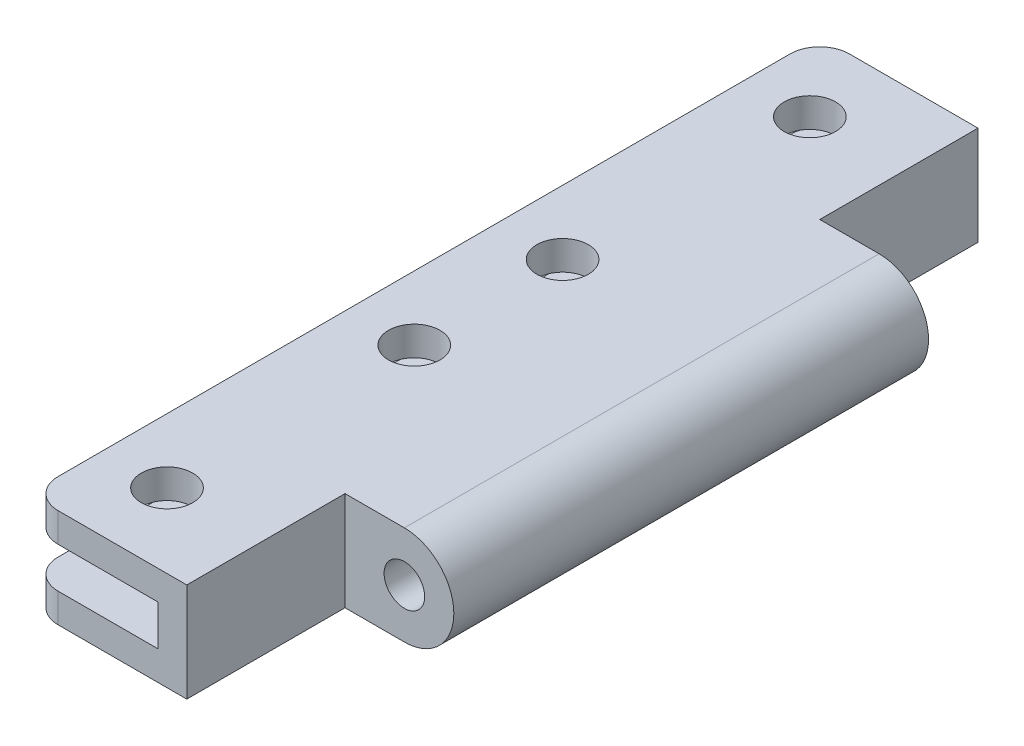
ISO-10303-21;
HEADER;
FILE_DESCRIPTION(('STEP AP214'),'2;1');
FILE_NAME('part.step','',(''),(''),'','','');
FILE_SCHEMA(('AUTOMOTIVE_DESIGN { 1 0 10303 214 1 1 1 1 }'));
ENDSEC;
DATA;
#1=APPLICATION_CONTEXT('core data for automotive mechanical design processes');
#2=APPLICATION_PROTOCOL_DEFINITION('international standard','automotive_design',2000,#1);
#3=PRODUCT_CONTEXT('',#1,'mechanical');
#4=PRODUCT('Part','Part','',(#3));
#5=PRODUCT_RELATED_PRODUCT_CATEGORY('part','',(#4));
#6=PRODUCT_DEFINITION_FORMATION('','',#4);
#7=PRODUCT_DEFINITION_CONTEXT('part definition',#1,'design');
#8=PRODUCT_DEFINITION('design','',#6,#7);
#9=PRODUCT_DEFINITION_SHAPE('','',#8);
#10=(LENGTH_UNIT() NAMED_UNIT(*) SI_UNIT(.MILLI.,.METRE.));
#11=(NAMED_UNIT(*) PLANE_ANGLE_UNIT() SI_UNIT($,.RADIAN.));
#12=(NAMED_UNIT(*) SI_UNIT($,.STERADIAN.) SOLID_ANGLE_UNIT());
#13=UNCERTAINTY_MEASURE_WITH_UNIT(LENGTH_MEASURE(1.E-05),#10,'distance_accuracy_value','');
#14=(GEOMETRIC_REPRESENTATION_CONTEXT(3) GLOBAL_UNCERTAINTY_ASSIGNED_CONTEXT((#13)) GLOBAL_UNIT_ASSIGNED_CONTEXT((#10,
#11,#12)) REPRESENTATION_CONTEXT('',''));
#15=CARTESIAN_POINT('',(0.,0.,0.));
#16=DIRECTION('',(0.,0.,1.));
#17=DIRECTION('',(1.,0.,0.));
#18=AXIS2_PLACEMENT_3D('',#15,#16,#17);
#19=CARTESIAN_POINT('',(0.,-5.,80.));
#20=DIRECTION('',(1.,0.,0.));
#21=DIRECTION('',(0.,1.,0.));
#22=AXIS2_PLACEMENT_3D('',#19,#20,#21);
#23=PLANE('',#22);
#24=DIRECTION('',(0.,0.,-1.));
#25=VECTOR('',#24,1.);
#26=CARTESIAN_POINT('',(0.,5.,80.));
#27=LINE('',#26,#25);
#28=CARTESIAN_POINT('',(0.,5.,77.));
#29=VERTEX_POINT('',#28);
#30=CARTESIAN_POINT('',(0.,5.,3.00000000000003));
#31=VERTEX_POINT('',#30);
#32=EDGE_CURVE('E266',#29,#31,#27,.T.);
#33=ORIENTED_EDGE('',*,*,#32,.T.);
#34=DIRECTION('',(0.,-1.,0.));
#35=VECTOR('',#34,1.);
#36=CARTESIAN_POINT('',(0.,2.05,3.));
#37=LINE('',#36,#35);
#38=CARTESIAN_POINT('',(0.,2.05,3.));
#39=VERTEX_POINT('',#38);
#40=EDGE_CURVE('E317',#31,#39,#37,.T.);
#41=ORIENTED_EDGE('',*,*,#40,.T.);
#42=DIRECTION('',(0.,0.,1.));
#43=VECTOR('',#42,1.);
#44=CARTESIAN_POINT('',(0.,2.05,80.));
#45=LINE('',#44,#43);
#46=CARTESIAN_POINT('',(0.,2.05,77.));
#47=VERTEX_POINT('',#46);
#48=EDGE_CURVE('E281',#39,#47,#45,.T.);
#49=ORIENTED_EDGE('',*,*,#48,.T.);
#50=DIRECTION('',(0.,-1.,0.));
#51=VECTOR('',#50,1.);
#52=CARTESIAN_POINT('',(0.,-5.,77.));
#53=LINE('',#52,#51);
#54=EDGE_CURVE('E315',#47,#29,#53,.F.);
#55=ORIENTED_EDGE('',*,*,#54,.T.);
#56=EDGE_LOOP('',(#33,#41,#49,#55));
#57=FACE_BOUND('',#56,.T.);
#58=ADVANCED_FACE('F34',(#57),#23,.F.);
#59=CARTESIAN_POINT('',(22.,0.,80.));
#60=DIRECTION('',(0.,0.,-1.));
#61=DIRECTION('',(-1.,0.,0.));
#62=AXIS2_PLACEMENT_3D('',#59,#60,#61);
#63=PLANE('',#62);
#64=DIRECTION('',(-1.,0.,0.));
#65=VECTOR('',#64,1.);
#66=CARTESIAN_POINT('',(0.,5.,80.));
#67=LINE('',#66,#65);
#68=CARTESIAN_POINT('',(15.9999999999998,5.,80.));
#69=VERTEX_POINT('',#68);
#70=CARTESIAN_POINT('',(3.,5.,80.));
#71=VERTEX_POINT('',#70);
#72=EDGE_CURVE('E263',#69,#71,#67,.T.);
#73=ORIENTED_EDGE('',*,*,#72,.T.);
#74=DIRECTION('',(0.,-1.,0.));
#75=VECTOR('',#74,1.);
#76=CARTESIAN_POINT('',(3.,0.,80.));
#77=LINE('',#76,#75);
#78=CARTESIAN_POINT('',(3.,2.05,80.));
#79=VERTEX_POINT('',#78);
#80=EDGE_CURVE('E11',#71,#79,#77,.T.);
#81=ORIENTED_EDGE('',*,*,#80,.T.);
#82=DIRECTION('',(-1.,0.,0.));
#83=VECTOR('',#82,1.);
#84=CARTESIAN_POINT('',(0.,2.05,80.));
#85=LINE('',#84,#83);
#86=CARTESIAN_POINT('',(13.1,2.05,80.));
#87=VERTEX_POINT('',#86);
#88=EDGE_CURVE('E247',#87,#79,#85,.T.);
#89=ORIENTED_EDGE('',*,*,#88,.F.);
#90=DIRECTION('',(0.,1.,0.));
#91=VECTOR('',#90,1.);
#92=CARTESIAN_POINT('',(13.1,2.05,80.));
#93=LINE('',#92,#91);
#94=CARTESIAN_POINT('',(13.1,-2.05,80.));
#95=VERTEX_POINT('',#94);
#96=EDGE_CURVE('E244',#95,#87,#93,.T.);
#97=ORIENTED_EDGE('',*,*,#96,.F.);
#98=DIRECTION('',(1.,0.,0.));
#99=VECTOR('',#98,1.);
#100=CARTESIAN_POINT('',(13.1,-2.05,80.));
#101=LINE('',#100,#99);
#102=CARTESIAN_POINT('',(3.,-2.05,80.));
#103=VERTEX_POINT('',#102);
#104=EDGE_CURVE('E242',#103,#95,#101,.T.);
#105=ORIENTED_EDGE('',*,*,#104,.F.);
#106=DIRECTION('',(0.,-1.,0.));
#107=VECTOR('',#106,1.);
#108=CARTESIAN_POINT('',(3.,0.,80.));
#109=LINE('',#108,#107);
#110=CARTESIAN_POINT('',(3.,-5.,80.));
#111=VERTEX_POINT('',#110);
#112=EDGE_CURVE('E42',#103,#111,#109,.T.);
#113=ORIENTED_EDGE('',*,*,#112,.T.);
#114=DIRECTION('',(1.,0.,0.));
#115=VECTOR('',#114,1.);
#116=CARTESIAN_POINT('',(22.,-5.,80.));
#117=LINE('',#116,#115);
#118=CARTESIAN_POINT('',(15.9999999999998,-5.,80.));
#119=VERTEX_POINT('',#118);
#120=EDGE_CURVE('E261',#111,#119,#117,.T.);
#121=ORIENTED_EDGE('',*,*,#120,.T.);
#122=DIRECTION('',(0.,1.,0.));
#123=VECTOR('',#122,1.);
#124=CARTESIAN_POINT('',(15.9999999999998,-15.,80.));
#125=LINE('',#124,#123);
#126=EDGE_CURVE('E183',#119,#69,#125,.T.);
#127=ORIENTED_EDGE('',*,*,#126,.T.);
#128=EDGE_LOOP('',(#73,#81,#89,#97,#105,#113,#121,#127));
#129=FACE_BOUND('',#128,.T.);
#130=ADVANCED_FACE('F330',(#129),#63,.F.);
#131=CARTESIAN_POINT('',(22.,0.,0.));
#132=DIRECTION('',(0.,0.,-1.));
#133=DIRECTION('',(-1.,0.,0.));
#134=AXIS2_PLACEMENT_3D('',#131,#132,#133);
#135=PLANE('',#134);
#136=DIRECTION('',(1.,0.,0.));
#137=VECTOR('',#136,1.);
#138=CARTESIAN_POINT('',(22.,-5.,0.));
#139=LINE('',#138,#137);
#140=CARTESIAN_POINT('',(3.,-5.,0.));
#141=VERTEX_POINT('',#140);
#142=CARTESIAN_POINT('',(15.9999999999998,-5.,0.));
#143=VERTEX_POINT('',#142);
#144=EDGE_CURVE('E260',#141,#143,#139,.T.);
#145=ORIENTED_EDGE('',*,*,#144,.F.);
#146=DIRECTION('',(0.,-1.,0.));
#147=VECTOR('',#146,1.);
#148=CARTESIAN_POINT('',(3.,-2.05,0.));
#149=LINE('',#148,#147);
#150=CARTESIAN_POINT('',(3.,-2.05,0.));
#151=VERTEX_POINT('',#150);
#152=EDGE_CURVE('E309',#141,#151,#149,.F.);
#153=ORIENTED_EDGE('',*,*,#152,.T.);
#154=DIRECTION('',(-1.,0.,0.));
#155=VECTOR('',#154,1.);
#156=CARTESIAN_POINT('',(22.,-2.05,0.));
#157=LINE('',#156,#155);
#158=CARTESIAN_POINT('',(13.1,-2.05,0.));
#159=VERTEX_POINT('',#158);
#160=EDGE_CURVE('E253',#159,#151,#157,.T.);
#161=ORIENTED_EDGE('',*,*,#160,.F.);
#162=DIRECTION('',(0.,-1.,0.));
#163=VECTOR('',#162,1.);
#164=CARTESIAN_POINT('',(13.1,0.,0.));
#165=LINE('',#164,#163);
#166=CARTESIAN_POINT('',(13.1,2.05,0.));
#167=VERTEX_POINT('',#166);
#168=EDGE_CURVE('E284',#167,#159,#165,.T.);
#169=ORIENTED_EDGE('',*,*,#168,.F.);
#170=DIRECTION('',(1.,0.,0.));
#171=VECTOR('',#170,1.);
#172=CARTESIAN_POINT('',(22.,2.05,0.));
#173=LINE('',#172,#171);
#174=CARTESIAN_POINT('',(3.,2.05,0.));
#175=VERTEX_POINT('',#174);
#176=EDGE_CURVE('E258',#175,#167,#173,.T.);
#177=ORIENTED_EDGE('',*,*,#176,.F.);
#178=DIRECTION('',(0.,-1.,0.));
#179=VECTOR('',#178,1.);
#180=CARTESIAN_POINT('',(3.,5.,0.));
#181=LINE('',#180,#179);
#182=CARTESIAN_POINT('',(3.,5.,0.));
#183=VERTEX_POINT('',#182);
#184=EDGE_CURVE('E307',#175,#183,#181,.F.);
#185=ORIENTED_EDGE('',*,*,#184,.T.);
#186=DIRECTION('',(-1.,0.,0.));
#187=VECTOR('',#186,1.);
#188=CARTESIAN_POINT('',(0.,5.,0.));
#189=LINE('',#188,#187);
#190=CARTESIAN_POINT('',(15.9999999999998,5.,0.));
#191=VERTEX_POINT('',#190);
#192=EDGE_CURVE('E264',#191,#183,#189,.T.);
#193=ORIENTED_EDGE('',*,*,#192,.F.);
#194=DIRECTION('',(0.,1.,0.));
#195=VECTOR('',#194,1.);
#196=CARTESIAN_POINT('',(15.9999999999998,-15.,0.));
#197=LINE('',#196,#195);
#198=EDGE_CURVE('E160',#143,#191,#197,.T.);
#199=ORIENTED_EDGE('',*,*,#198,.F.);
#200=EDGE_LOOP('',(#145,#153,#161,#169,#177,#185,#193,#199));
#201=FACE_BOUND('',#200,.T.);
#202=ADVANCED_FACE('F368',(#201),#135,.T.);
#203=DIRECTION('',(0.,0.,-1.));
#204=VECTOR('',#203,1.);
#205=CARTESIAN_POINT('',(0.,-2.05,80.));
#206=LINE('',#205,#204);
#207=CARTESIAN_POINT('',(0.,-2.05,77.));
#208=VERTEX_POINT('',#207);
#209=CARTESIAN_POINT('',(0.,-2.05,3.));
#210=VERTEX_POINT('',#209);
#211=EDGE_CURVE('E278',#208,#210,#206,.T.);
#212=ORIENTED_EDGE('',*,*,#211,.T.);
#213=DIRECTION('',(0.,-1.,0.));
#214=VECTOR('',#213,1.);
#215=CARTESIAN_POINT('',(0.,-5.,3.));
#216=LINE('',#215,#214);
#217=CARTESIAN_POINT('',(0.,-5.,3.00000000000003));
#218=VERTEX_POINT('',#217);
#219=EDGE_CURVE('E300',#210,#218,#216,.T.);
#220=ORIENTED_EDGE('',*,*,#219,.T.);
#221=DIRECTION('',(0.,0.,-1.));
#222=VECTOR('',#221,1.);
#223=CARTESIAN_POINT('',(0.,-5.,80.));
#224=LINE('',#223,#222);
#225=CARTESIAN_POINT('',(0.,-5.,77.));
#226=VERTEX_POINT('',#225);
#227=EDGE_CURVE('E275',#226,#218,#224,.T.);
#228=ORIENTED_EDGE('',*,*,#227,.F.);
#229=DIRECTION('',(0.,-1.,0.));
#230=VECTOR('',#229,1.);
#231=CARTESIAN_POINT('',(0.,-5.,77.));
#232=LINE('',#231,#230);
#233=EDGE_CURVE('E286',#226,#208,#232,.F.);
#234=ORIENTED_EDGE('',*,*,#233,.T.);
#235=EDGE_LOOP('',(#212,#220,#228,#234));
#236=FACE_BOUND('',#235,.T.);
#237=ADVANCED_FACE('F375',(#236),#23,.F.);
#238=CARTESIAN_POINT('',(22.,-5.,80.));
#239=DIRECTION('',(0.,1.,0.));
#240=DIRECTION('',(-1.,0.,0.));
#241=AXIS2_PLACEMENT_3D('',#238,#239,#240);
#242=PLANE('',#241);
#243=CARTESIAN_POINT('',(6.5,-5.,7.50000000000002));
#244=DIRECTION('',(0.,1.,0.));
#245=DIRECTION('',(-1.,0.,0.));
#246=AXIS2_PLACEMENT_3D('',#243,#244,#245);
#247=CIRCLE('',#246,2.6);
#248=CARTESIAN_POINT('',(3.9,-5.,7.50000000000002));
#249=VERTEX_POINT('',#248);
#250=EDGE_CURVE('E239',#249,#249,#247,.T.);
#251=ORIENTED_EDGE('',*,*,#250,.T.);
#252=EDGE_LOOP('',(#251));
#253=FACE_BOUND('',#252,.T.);
#254=CARTESIAN_POINT('',(6.5,-5.,47.5));
#255=DIRECTION('',(0.,1.,0.));
#256=DIRECTION('',(-1.,0.,0.));
#257=AXIS2_PLACEMENT_3D('',#254,#255,#256);
#258=CIRCLE('',#257,2.6);
#259=CARTESIAN_POINT('',(3.9,-5.,47.5));
#260=VERTEX_POINT('',#259);
#261=EDGE_CURVE('E232',#260,#260,#258,.T.);
#262=ORIENTED_EDGE('',*,*,#261,.T.);
#263=EDGE_LOOP('',(#262));
#264=FACE_BOUND('',#263,.T.);
#265=CARTESIAN_POINT('',(6.5,-5.,72.5));
#266=DIRECTION('',(0.,1.,0.));
#267=DIRECTION('',(-1.,0.,0.));
#268=AXIS2_PLACEMENT_3D('',#265,#266,#267);
#269=CIRCLE('',#268,2.6);
#270=CARTESIAN_POINT('',(3.9,-5.,72.5));
#271=VERTEX_POINT('',#270);
#272=EDGE_CURVE('E225',#271,#271,#269,.T.);
#273=ORIENTED_EDGE('',*,*,#272,.T.);
#274=EDGE_LOOP('',(#273));
#275=FACE_BOUND('',#274,.T.);
#276=CARTESIAN_POINT('',(6.5,-5.,32.5));
#277=DIRECTION('',(0.,1.,0.));
#278=DIRECTION('',(-1.,0.,0.));
#279=AXIS2_PLACEMENT_3D('',#276,#277,#278);
#280=CIRCLE('',#279,2.6);
#281=CARTESIAN_POINT('',(3.9,-5.,32.5));
#282=VERTEX_POINT('',#281);
#283=EDGE_CURVE('E218',#282,#282,#280,.T.);
#284=ORIENTED_EDGE('',*,*,#283,.T.);
#285=EDGE_LOOP('',(#284));
#286=FACE_BOUND('',#285,.T.);
#287=ORIENTED_EDGE('',*,*,#227,.T.);
#288=CARTESIAN_POINT('',(3.,-5.,3.));
#289=DIRECTION('',(0.,1.,0.));
#290=DIRECTION('',(-1.,0.,0.));
#291=AXIS2_PLACEMENT_3D('',#288,#289,#290);
#292=CIRCLE('',#291,3.);
#293=EDGE_CURVE('E305',#218,#141,#292,.F.);
#294=ORIENTED_EDGE('',*,*,#293,.T.);
#295=ORIENTED_EDGE('',*,*,#144,.T.);
#296=DIRECTION('',(0.,0.,1.));
#297=VECTOR('',#296,1.);
#298=CARTESIAN_POINT('',(15.9999999999998,-5.,80.));
#299=LINE('',#298,#297);
#300=CARTESIAN_POINT('',(15.9999999999998,-5.,16.));
#301=VERTEX_POINT('',#300);
#302=EDGE_CURVE('E200',#143,#301,#299,.T.);
#303=ORIENTED_EDGE('',*,*,#302,.T.);
#304=DIRECTION('',(1.,0.,0.));
#305=VECTOR('',#304,1.);
#306=CARTESIAN_POINT('',(22.,-5.,16.));
#307=LINE('',#306,#305);
#308=CARTESIAN_POINT('',(22.,-5.,16.));
#309=VERTEX_POINT('',#308);
#310=EDGE_CURVE('E155',#301,#309,#307,.T.);
#311=ORIENTED_EDGE('',*,*,#310,.T.);
#312=DIRECTION('',(0.,0.,-1.));
#313=VECTOR('',#312,1.);
#314=CARTESIAN_POINT('',(22.,-5.,80.));
#315=LINE('',#314,#313);
#316=CARTESIAN_POINT('',(22.,-5.,64.));
#317=VERTEX_POINT('',#316);
#318=EDGE_CURVE('E272',#317,#309,#315,.T.);
#319=ORIENTED_EDGE('',*,*,#318,.F.);
#320=DIRECTION('',(-1.,0.,0.));
#321=VECTOR('',#320,1.);
#322=CARTESIAN_POINT('',(22.,-5.,64.));
#323=LINE('',#322,#321);
#324=CARTESIAN_POINT('',(15.9999999999998,-5.,64.));
#325=VERTEX_POINT('',#324);
#326=EDGE_CURVE('E190',#317,#325,#323,.T.);
#327=ORIENTED_EDGE('',*,*,#326,.T.);
#328=DIRECTION('',(0.,0.,1.));
#329=VECTOR('',#328,1.);
#330=CARTESIAN_POINT('',(15.9999999999998,-5.,80.));
#331=LINE('',#330,#329);
#332=EDGE_CURVE('E197',#325,#119,#331,.T.);
#333=ORIENTED_EDGE('',*,*,#332,.T.);
#334=ORIENTED_EDGE('',*,*,#120,.F.);
#335=CARTESIAN_POINT('',(3.,-5.,77.));
#336=DIRECTION('',(0.,1.,0.));
#337=DIRECTION('',(-1.,0.,0.));
#338=AXIS2_PLACEMENT_3D('',#335,#336,#337);
#339=CIRCLE('',#338,3.);
#340=EDGE_CURVE('E303',#111,#226,#339,.F.);
#341=ORIENTED_EDGE('',*,*,#340,.T.);
#342=EDGE_LOOP('',(#287,#294,#295,#303,#311,#319,#327,#333,#334,#341));
#343=FACE_BOUND('',#342,.T.);
#344=ADVANCED_FACE('F336',(#253,#264,#275,#286,#343),#242,.F.);
#345=CARTESIAN_POINT('',(22.,0.,80.));
#346=DIRECTION('',(0.,0.,-1.));
#347=DIRECTION('',(-1.,0.,0.));
#348=AXIS2_PLACEMENT_3D('',#345,#346,#347);
#349=CYLINDRICAL_SURFACE('',#348,5.);
#350=ORIENTED_EDGE('',*,*,#318,.T.);
#351=CARTESIAN_POINT('',(22.,0.,16.));
#352=DIRECTION('',(0.,0.,1.));
#353=DIRECTION('',(1.,0.,0.));
#354=AXIS2_PLACEMENT_3D('',#351,#352,#353);
#355=CIRCLE('',#354,5.);
#356=CARTESIAN_POINT('',(22.,5.,16.));
#357=VERTEX_POINT('',#356);
#358=EDGE_CURVE('E194',#309,#357,#355,.T.);
#359=ORIENTED_EDGE('',*,*,#358,.T.);
#360=DIRECTION('',(0.,0.,-1.));
#361=VECTOR('',#360,1.);
#362=CARTESIAN_POINT('',(22.,5.,80.));
#363=LINE('',#362,#361);
#364=CARTESIAN_POINT('',(22.,5.,64.));
#365=VERTEX_POINT('',#364);
#366=EDGE_CURVE('E174',#365,#357,#363,.T.);
#367=ORIENTED_EDGE('',*,*,#366,.F.);
#368=CARTESIAN_POINT('',(22.,0.,64.));
#369=DIRECTION('',(0.,0.,-1.));
#370=DIRECTION('',(-1.,0.,0.));
#371=AXIS2_PLACEMENT_3D('',#368,#369,#370);
#372=CIRCLE('',#371,5.);
#373=EDGE_CURVE('E187',#365,#317,#372,.T.);
#374=ORIENTED_EDGE('',*,*,#373,.T.);
#375=EDGE_LOOP('',(#350,#359,#367,#374));
#376=FACE_BOUND('',#375,.T.);
#377=ADVANCED_FACE('F394',(#376),#349,.T.);
#378=CARTESIAN_POINT('',(0.,5.,80.));
#379=DIRECTION('',(0.,-1.,0.));
#380=DIRECTION('',(0.,0.,-1.));
#381=AXIS2_PLACEMENT_3D('',#378,#379,#380);
#382=PLANE('',#381);
#383=CARTESIAN_POINT('',(6.5,5.,7.50000000000002));
#384=DIRECTION('',(0.,1.,0.));
#385=DIRECTION('',(0.,0.,1.));
#386=AXIS2_PLACEMENT_3D('',#383,#384,#385);
#387=CIRCLE('',#386,2.6);
#388=CARTESIAN_POINT('',(6.5,5.,10.1));
#389=VERTEX_POINT('',#388);
#390=EDGE_CURVE('E202',#389,#389,#387,.T.);
#391=ORIENTED_EDGE('',*,*,#390,.F.);
#392=EDGE_LOOP('',(#391));
#393=FACE_BOUND('',#392,.T.);
#394=CARTESIAN_POINT('',(6.5,5.,47.5));
#395=DIRECTION('',(0.,1.,0.));
#396=DIRECTION('',(0.,0.,1.));
#397=AXIS2_PLACEMENT_3D('',#394,#395,#396);
#398=CIRCLE('',#397,2.6);
#399=CARTESIAN_POINT('',(6.5,5.,50.1));
#400=VERTEX_POINT('',#399);
#401=EDGE_CURVE('E207',#400,#400,#398,.T.);
#402=ORIENTED_EDGE('',*,*,#401,.F.);
#403=EDGE_LOOP('',(#402));
#404=FACE_BOUND('',#403,.T.);
#405=CARTESIAN_POINT('',(6.5,5.,72.5));
#406=DIRECTION('',(0.,1.,0.));
#407=DIRECTION('',(0.,0.,-1.));
#408=AXIS2_PLACEMENT_3D('',#405,#406,#407);
#409=CIRCLE('',#408,2.6);
#410=CARTESIAN_POINT('',(6.5,5.,69.9));
#411=VERTEX_POINT('',#410);
#412=EDGE_CURVE('E203',#411,#411,#409,.T.);
#413=ORIENTED_EDGE('',*,*,#412,.F.);
#414=EDGE_LOOP('',(#413));
#415=FACE_BOUND('',#414,.T.);
#416=CARTESIAN_POINT('',(6.5,5.,32.5));
#417=DIRECTION('',(0.,1.,0.));
#418=DIRECTION('',(0.,0.,-1.));
#419=AXIS2_PLACEMENT_3D('',#416,#417,#418);
#420=CIRCLE('',#419,2.6);
#421=CARTESIAN_POINT('',(6.5,5.,29.9));
#422=VERTEX_POINT('',#421);
#423=EDGE_CURVE('E206',#422,#422,#420,.T.);
#424=ORIENTED_EDGE('',*,*,#423,.F.);
#425=EDGE_LOOP('',(#424));
#426=FACE_BOUND('',#425,.T.);
#427=ORIENTED_EDGE('',*,*,#192,.T.);
#428=CARTESIAN_POINT('',(3.,5.,3.));
#429=DIRECTION('',(0.,-1.,0.));
#430=DIRECTION('',(0.,0.,-1.));
#431=AXIS2_PLACEMENT_3D('',#428,#429,#430);
#432=CIRCLE('',#431,3.);
#433=EDGE_CURVE('E324',#183,#31,#432,.F.);
#434=ORIENTED_EDGE('',*,*,#433,.T.);
#435=ORIENTED_EDGE('',*,*,#32,.F.);
#436=CARTESIAN_POINT('',(3.,5.,77.));
#437=DIRECTION('',(0.,-1.,0.));
#438=DIRECTION('',(0.,0.,-1.));
#439=AXIS2_PLACEMENT_3D('',#436,#437,#438);
#440=CIRCLE('',#439,3.);
#441=EDGE_CURVE('E49',#29,#71,#440,.F.);
#442=ORIENTED_EDGE('',*,*,#441,.T.);
#443=ORIENTED_EDGE('',*,*,#72,.F.);
#444=DIRECTION('',(0.,0.,1.));
#445=VECTOR('',#444,1.);
#446=CARTESIAN_POINT('',(15.9999999999998,5.,80.));
#447=LINE('',#446,#445);
#448=CARTESIAN_POINT('',(15.9999999999998,5.,64.));
#449=VERTEX_POINT('',#448);
#450=EDGE_CURVE('E178',#449,#69,#447,.T.);
#451=ORIENTED_EDGE('',*,*,#450,.F.);
#452=DIRECTION('',(-1.,0.,0.));
#453=VECTOR('',#452,1.);
#454=CARTESIAN_POINT('',(15.9999999999998,5.,64.));
#455=LINE('',#454,#453);
#456=EDGE_CURVE('E180',#365,#449,#455,.T.);
#457=ORIENTED_EDGE('',*,*,#456,.F.);
#458=ORIENTED_EDGE('',*,*,#366,.T.);
#459=DIRECTION('',(1.,0.,0.));
#460=VECTOR('',#459,1.);
#461=CARTESIAN_POINT('',(15.9999999999998,5.,16.));
#462=LINE('',#461,#460);
#463=CARTESIAN_POINT('',(15.9999999999998,5.,16.));
#464=VERTEX_POINT('',#463);
#465=EDGE_CURVE('E152',#464,#357,#462,.T.);
#466=ORIENTED_EDGE('',*,*,#465,.F.);
#467=DIRECTION('',(0.,0.,1.));
#468=VECTOR('',#467,1.);
#469=CARTESIAN_POINT('',(15.9999999999998,5.,0.));
#470=LINE('',#469,#468);
#471=EDGE_CURVE('E163',#191,#464,#470,.T.);
#472=ORIENTED_EDGE('',*,*,#471,.F.);
#473=EDGE_LOOP('',(#427,#434,#435,#442,#443,#451,#457,#458,#466,#472));
#474=FACE_BOUND('',#473,.T.);
#475=ADVANCED_FACE('F171',(#393,#404,#415,#426,#474),#382,.F.);
#476=CARTESIAN_POINT('',(0.,2.05,-15.));
#477=DIRECTION('',(0.,1.,0.));
#478=DIRECTION('',(-1.,0.,0.));
#479=AXIS2_PLACEMENT_3D('',#476,#477,#478);
#480=PLANE('',#479);
#481=CARTESIAN_POINT('',(6.5,2.05,7.50000000000002));
#482=DIRECTION('',(0.,1.,0.));
#483=DIRECTION('',(-1.,0.,0.));
#484=AXIS2_PLACEMENT_3D('',#481,#482,#483);
#485=CIRCLE('',#484,2.6);
#486=CARTESIAN_POINT('',(3.9,2.05,7.50000000000002));
#487=VERTEX_POINT('',#486);
#488=EDGE_CURVE('E236',#487,#487,#485,.T.);
#489=ORIENTED_EDGE('',*,*,#488,.T.);
#490=EDGE_LOOP('',(#489));
#491=FACE_BOUND('',#490,.T.);
#492=CARTESIAN_POINT('',(6.5,2.05,47.5));
#493=DIRECTION('',(0.,1.,0.));
#494=DIRECTION('',(-1.,0.,0.));
#495=AXIS2_PLACEMENT_3D('',#492,#493,#494);
#496=CIRCLE('',#495,2.6);
#497=CARTESIAN_POINT('',(3.9,2.05,47.5));
#498=VERTEX_POINT('',#497);
#499=EDGE_CURVE('E229',#498,#498,#496,.T.);
#500=ORIENTED_EDGE('',*,*,#499,.T.);
#501=EDGE_LOOP('',(#500));
#502=FACE_BOUND('',#501,.T.);
#503=CARTESIAN_POINT('',(6.5,2.05,72.5));
#504=DIRECTION('',(0.,1.,0.));
#505=DIRECTION('',(-1.,0.,0.));
#506=AXIS2_PLACEMENT_3D('',#503,#504,#505);
#507=CIRCLE('',#506,2.6);
#508=CARTESIAN_POINT('',(3.9,2.05,72.5));
#509=VERTEX_POINT('',#508);
#510=EDGE_CURVE('E222',#509,#509,#507,.T.);
#511=ORIENTED_EDGE('',*,*,#510,.T.);
#512=EDGE_LOOP('',(#511));
#513=FACE_BOUND('',#512,.T.);
#514=CARTESIAN_POINT('',(6.5,2.05,32.5));
#515=DIRECTION('',(0.,1.,0.));
#516=DIRECTION('',(-1.,0.,0.));
#517=AXIS2_PLACEMENT_3D('',#514,#515,#516);
#518=CIRCLE('',#517,2.6);
#519=CARTESIAN_POINT('',(3.9,2.05,32.5));
#520=VERTEX_POINT('',#519);
#521=EDGE_CURVE('E215',#520,#520,#518,.T.);
#522=ORIENTED_EDGE('',*,*,#521,.T.);
#523=EDGE_LOOP('',(#522));
#524=FACE_BOUND('',#523,.T.);
#525=ORIENTED_EDGE('',*,*,#48,.F.);
#526=CARTESIAN_POINT('',(3.,2.05,3.));
#527=DIRECTION('',(0.,1.,0.));
#528=DIRECTION('',(-1.,0.,0.));
#529=AXIS2_PLACEMENT_3D('',#526,#527,#528);
#530=CIRCLE('',#529,3.);
#531=EDGE_CURVE('E321',#39,#175,#530,.F.);
#532=ORIENTED_EDGE('',*,*,#531,.T.);
#533=ORIENTED_EDGE('',*,*,#176,.T.);
#534=DIRECTION('',(0.,0.,1.));
#535=VECTOR('',#534,1.);
#536=CARTESIAN_POINT('',(13.1,2.05,-15.));
#537=LINE('',#536,#535);
#538=EDGE_CURVE('E251',#167,#87,#537,.T.);
#539=ORIENTED_EDGE('',*,*,#538,.T.);
#540=ORIENTED_EDGE('',*,*,#88,.T.);
#541=CARTESIAN_POINT('',(3.,2.05,77.));
#542=DIRECTION('',(0.,1.,0.));
#543=DIRECTION('',(-1.,0.,0.));
#544=AXIS2_PLACEMENT_3D('',#541,#542,#543);
#545=CIRCLE('',#544,3.);
#546=EDGE_CURVE('E57',#79,#47,#545,.F.);
#547=ORIENTED_EDGE('',*,*,#546,.T.);
#548=EDGE_LOOP('',(#525,#532,#533,#539,#540,#547));
#549=FACE_BOUND('',#548,.T.);
#550=ADVANCED_FACE('F355',(#491,#502,#513,#524,#549),#480,.F.);
#551=CARTESIAN_POINT('',(13.1,2.05,-15.));
#552=DIRECTION('',(1.,0.,0.));
#553=DIRECTION('',(0.,0.,-1.));
#554=AXIS2_PLACEMENT_3D('',#551,#552,#553);
#555=PLANE('',#554);
#556=ORIENTED_EDGE('',*,*,#168,.T.);
#557=DIRECTION('',(0.,0.,1.));
#558=VECTOR('',#557,1.);
#559=CARTESIAN_POINT('',(13.1,-2.05,-15.));
#560=LINE('',#559,#558);
#561=EDGE_CURVE('E250',#159,#95,#560,.T.);
#562=ORIENTED_EDGE('',*,*,#561,.T.);
#563=ORIENTED_EDGE('',*,*,#96,.T.);
#564=ORIENTED_EDGE('',*,*,#538,.F.);
#565=EDGE_LOOP('',(#556,#562,#563,#564));
#566=FACE_BOUND('',#565,.T.);
#567=ADVANCED_FACE('F359',(#566),#555,.F.);
#568=CARTESIAN_POINT('',(13.1,-2.05,-15.));
#569=DIRECTION('',(0.,-1.,0.));
#570=DIRECTION('',(1.,0.,0.));
#571=AXIS2_PLACEMENT_3D('',#568,#569,#570);
#572=PLANE('',#571);
#573=CARTESIAN_POINT('',(6.5,-2.05,7.50000000000002));
#574=DIRECTION('',(0.,-1.,0.));
#575=DIRECTION('',(1.,0.,0.));
#576=AXIS2_PLACEMENT_3D('',#573,#574,#575);
#577=CIRCLE('',#576,2.6);
#578=CARTESIAN_POINT('',(9.1,-2.05,7.50000000000002));
#579=VERTEX_POINT('',#578);
#580=EDGE_CURVE('E235',#579,#579,#577,.T.);
#581=ORIENTED_EDGE('',*,*,#580,.T.);
#582=EDGE_LOOP('',(#581));
#583=FACE_BOUND('',#582,.T.);
#584=CARTESIAN_POINT('',(6.5,-2.05,47.5));
#585=DIRECTION('',(0.,-1.,0.));
#586=DIRECTION('',(1.,0.,0.));
#587=AXIS2_PLACEMENT_3D('',#584,#585,#586);
#588=CIRCLE('',#587,2.6);
#589=CARTESIAN_POINT('',(9.1,-2.05,47.5));
#590=VERTEX_POINT('',#589);
#591=EDGE_CURVE('E228',#590,#590,#588,.T.);
#592=ORIENTED_EDGE('',*,*,#591,.T.);
#593=EDGE_LOOP('',(#592));
#594=FACE_BOUND('',#593,.T.);
#595=CARTESIAN_POINT('',(6.5,-2.05,72.5));
#596=DIRECTION('',(0.,-1.,0.));
#597=DIRECTION('',(1.,0.,0.));
#598=AXIS2_PLACEMENT_3D('',#595,#596,#597);
#599=CIRCLE('',#598,2.6);
#600=CARTESIAN_POINT('',(9.1,-2.05,72.5));
#601=VERTEX_POINT('',#600);
#602=EDGE_CURVE('E221',#601,#601,#599,.T.);
#603=ORIENTED_EDGE('',*,*,#602,.T.);
#604=EDGE_LOOP('',(#603));
#605=FACE_BOUND('',#604,.T.);
#606=CARTESIAN_POINT('',(6.5,-2.05,32.5));
#607=DIRECTION('',(0.,-1.,0.));
#608=DIRECTION('',(1.,0.,0.));
#609=AXIS2_PLACEMENT_3D('',#606,#607,#608);
#610=CIRCLE('',#609,2.6);
#611=CARTESIAN_POINT('',(9.1,-2.05,32.5));
#612=VERTEX_POINT('',#611);
#613=EDGE_CURVE('E214',#612,#612,#610,.T.);
#614=ORIENTED_EDGE('',*,*,#613,.T.);
#615=EDGE_LOOP('',(#614));
#616=FACE_BOUND('',#615,.T.);
#617=ORIENTED_EDGE('',*,*,#160,.T.);
#618=CARTESIAN_POINT('',(3.,-2.05,3.));
#619=DIRECTION('',(0.,-1.,0.));
#620=DIRECTION('',(1.,0.,0.));
#621=AXIS2_PLACEMENT_3D('',#618,#619,#620);
#622=CIRCLE('',#621,3.);
#623=EDGE_CURVE('E313',#151,#210,#622,.F.);
#624=ORIENTED_EDGE('',*,*,#623,.T.);
#625=ORIENTED_EDGE('',*,*,#211,.F.);
#626=CARTESIAN_POINT('',(3.,-2.05,77.));
#627=DIRECTION('',(0.,-1.,0.));
#628=DIRECTION('',(1.,0.,0.));
#629=AXIS2_PLACEMENT_3D('',#626,#627,#628);
#630=CIRCLE('',#629,3.);
#631=EDGE_CURVE('E311',#208,#103,#630,.F.);
#632=ORIENTED_EDGE('',*,*,#631,.T.);
#633=ORIENTED_EDGE('',*,*,#104,.T.);
#634=ORIENTED_EDGE('',*,*,#561,.F.);
#635=EDGE_LOOP('',(#617,#624,#625,#632,#633,#634));
#636=FACE_BOUND('',#635,.T.);
#637=ADVANCED_FACE('F364',(#583,#594,#605,#616,#636),#572,.F.);
#638=CARTESIAN_POINT('',(6.5,-15.,32.5));
#639=DIRECTION('',(0.,1.,0.));
#640=DIRECTION('',(0.,0.,1.));
#641=AXIS2_PLACEMENT_3D('',#638,#639,#640);
#642=CYLINDRICAL_SURFACE('',#641,2.6);
#643=ORIENTED_EDGE('',*,*,#613,.F.);
#644=EDGE_LOOP('',(#643));
#645=FACE_BOUND('',#644,.T.);
#646=ORIENTED_EDGE('',*,*,#283,.F.);
#647=EDGE_LOOP('',(#646));
#648=FACE_BOUND('',#647,.T.);
#649=ADVANCED_FACE('F436',(#645,#648),#642,.F.);
#650=CARTESIAN_POINT('',(6.5,-15.,72.5));
#651=DIRECTION('',(0.,1.,0.));
#652=DIRECTION('',(0.,0.,1.));
#653=AXIS2_PLACEMENT_3D('',#650,#651,#652);
#654=CYLINDRICAL_SURFACE('',#653,2.6);
#655=ORIENTED_EDGE('',*,*,#602,.F.);
#656=EDGE_LOOP('',(#655));
#657=FACE_BOUND('',#656,.T.);
#658=ORIENTED_EDGE('',*,*,#272,.F.);
#659=EDGE_LOOP('',(#658));
#660=FACE_BOUND('',#659,.T.);
#661=ADVANCED_FACE('F444',(#657,#660),#654,.F.);
#662=CARTESIAN_POINT('',(6.5,-15.,47.5));
#663=DIRECTION('',(0.,1.,0.));
#664=DIRECTION('',(0.,0.,1.));
#665=AXIS2_PLACEMENT_3D('',#662,#663,#664);
#666=CYLINDRICAL_SURFACE('',#665,2.6);
#667=ORIENTED_EDGE('',*,*,#591,.F.);
#668=EDGE_LOOP('',(#667));
#669=FACE_BOUND('',#668,.T.);
#670=ORIENTED_EDGE('',*,*,#261,.F.);
#671=EDGE_LOOP('',(#670));
#672=FACE_BOUND('',#671,.T.);
#673=ADVANCED_FACE('F453',(#669,#672),#666,.F.);
#674=CARTESIAN_POINT('',(6.5,-15.,7.50000000000002));
#675=DIRECTION('',(0.,1.,0.));
#676=DIRECTION('',(0.,0.,1.));
#677=AXIS2_PLACEMENT_3D('',#674,#675,#676);
#678=CYLINDRICAL_SURFACE('',#677,2.6);
#679=ORIENTED_EDGE('',*,*,#580,.F.);
#680=EDGE_LOOP('',(#679));
#681=FACE_BOUND('',#680,.T.);
#682=ORIENTED_EDGE('',*,*,#250,.F.);
#683=EDGE_LOOP('',(#682));
#684=FACE_BOUND('',#683,.T.);
#685=ADVANCED_FACE('F462',(#681,#684),#678,.F.);
#686=ORIENTED_EDGE('',*,*,#423,.T.);
#687=EDGE_LOOP('',(#686));
#688=FACE_BOUND('',#687,.T.);
#689=ORIENTED_EDGE('',*,*,#521,.F.);
#690=EDGE_LOOP('',(#689));
#691=FACE_BOUND('',#690,.T.);
#692=ADVANCED_FACE('F447',(#688,#691),#642,.F.);
#693=ORIENTED_EDGE('',*,*,#412,.T.);
#694=EDGE_LOOP('',(#693));
#695=FACE_BOUND('',#694,.T.);
#696=ORIENTED_EDGE('',*,*,#510,.F.);
#697=EDGE_LOOP('',(#696));
#698=FACE_BOUND('',#697,.T.);
#699=ADVANCED_FACE('F456',(#695,#698),#654,.F.);
#700=ORIENTED_EDGE('',*,*,#401,.T.);
#701=EDGE_LOOP('',(#700));
#702=FACE_BOUND('',#701,.T.);
#703=ORIENTED_EDGE('',*,*,#499,.F.);
#704=EDGE_LOOP('',(#703));
#705=FACE_BOUND('',#704,.T.);
#706=ADVANCED_FACE('F465',(#702,#705),#666,.F.);
#707=ORIENTED_EDGE('',*,*,#390,.T.);
#708=EDGE_LOOP('',(#707));
#709=FACE_BOUND('',#708,.T.);
#710=ORIENTED_EDGE('',*,*,#488,.F.);
#711=EDGE_LOOP('',(#710));
#712=FACE_BOUND('',#711,.T.);
#713=ADVANCED_FACE('F473',(#709,#712),#678,.F.);
#714=CARTESIAN_POINT('',(15.9999999999998,-15.,80.));
#715=DIRECTION('',(-1.,0.,0.));
#716=DIRECTION('',(0.,0.,1.));
#717=AXIS2_PLACEMENT_3D('',#714,#715,#716);
#718=PLANE('',#717);
#719=DIRECTION('',(0.,1.,0.));
#720=VECTOR('',#719,1.);
#721=CARTESIAN_POINT('',(15.9999999999998,-15.,64.));
#722=LINE('',#721,#720);
#723=EDGE_CURVE('E168',#325,#449,#722,.T.);
#724=ORIENTED_EDGE('',*,*,#723,.T.);
#725=ORIENTED_EDGE('',*,*,#450,.T.);
#726=ORIENTED_EDGE('',*,*,#126,.F.);
#727=ORIENTED_EDGE('',*,*,#332,.F.);
#728=EDGE_LOOP('',(#724,#725,#726,#727));
#729=FACE_BOUND('',#728,.T.);
#730=ADVANCED_FACE('F341',(#729),#718,.F.);
#731=CARTESIAN_POINT('',(15.9999999999998,-15.,64.));
#732=DIRECTION('',(0.,0.,-1.));
#733=DIRECTION('',(-1.,0.,0.));
#734=AXIS2_PLACEMENT_3D('',#731,#732,#733);
#735=PLANE('',#734);
#736=CARTESIAN_POINT('',(22.,0.,64.));
#737=DIRECTION('',(0.,0.,-1.));
#738=DIRECTION('',(-1.,0.,0.));
#739=AXIS2_PLACEMENT_3D('',#736,#737,#738);
#740=CIRCLE('',#739,2.05);
#741=CARTESIAN_POINT('',(19.95,0.,64.));
#742=VERTEX_POINT('',#741);
#743=EDGE_CURVE('E159',#742,#742,#740,.T.);
#744=ORIENTED_EDGE('',*,*,#743,.T.);
#745=EDGE_LOOP('',(#744));
#746=FACE_BOUND('',#745,.T.);
#747=ORIENTED_EDGE('',*,*,#373,.F.);
#748=ORIENTED_EDGE('',*,*,#456,.T.);
#749=ORIENTED_EDGE('',*,*,#723,.F.);
#750=ORIENTED_EDGE('',*,*,#326,.F.);
#751=EDGE_LOOP('',(#747,#748,#749,#750));
#752=FACE_BOUND('',#751,.T.);
#753=ADVANCED_FACE('F343',(#746,#752),#735,.F.);
#754=CARTESIAN_POINT('',(15.9999999999998,-15.,0.));
#755=DIRECTION('',(-1.,0.,0.));
#756=DIRECTION('',(0.,0.,1.));
#757=AXIS2_PLACEMENT_3D('',#754,#755,#756);
#758=PLANE('',#757);
#759=ORIENTED_EDGE('',*,*,#198,.T.);
#760=ORIENTED_EDGE('',*,*,#471,.T.);
#761=DIRECTION('',(0.,1.,0.));
#762=VECTOR('',#761,1.);
#763=CARTESIAN_POINT('',(15.9999999999998,-15.,16.));
#764=LINE('',#763,#762);
#765=EDGE_CURVE('E148',#301,#464,#764,.T.);
#766=ORIENTED_EDGE('',*,*,#765,.F.);
#767=ORIENTED_EDGE('',*,*,#302,.F.);
#768=EDGE_LOOP('',(#759,#760,#766,#767));
#769=FACE_BOUND('',#768,.T.);
#770=ADVANCED_FACE('F164',(#769),#758,.F.);
#771=CARTESIAN_POINT('',(15.9999999999998,-15.,16.));
#772=DIRECTION('',(0.,0.,1.));
#773=DIRECTION('',(1.,0.,0.));
#774=AXIS2_PLACEMENT_3D('',#771,#772,#773);
#775=PLANE('',#774);
#776=CARTESIAN_POINT('',(22.,0.,16.));
#777=DIRECTION('',(0.,0.,1.));
#778=DIRECTION('',(1.,0.,0.));
#779=AXIS2_PLACEMENT_3D('',#776,#777,#778);
#780=CIRCLE('',#779,2.05);
#781=CARTESIAN_POINT('',(19.95,0.,16.));
#782=VERTEX_POINT('',#781);
#783=EDGE_CURVE('E193',#782,#782,#780,.T.);
#784=ORIENTED_EDGE('',*,*,#783,.T.);
#785=EDGE_LOOP('',(#784));
#786=FACE_BOUND('',#785,.T.);
#787=ORIENTED_EDGE('',*,*,#765,.T.);
#788=ORIENTED_EDGE('',*,*,#465,.T.);
#789=ORIENTED_EDGE('',*,*,#358,.F.);
#790=ORIENTED_EDGE('',*,*,#310,.F.);
#791=EDGE_LOOP('',(#787,#788,#789,#790));
#792=FACE_BOUND('',#791,.T.);
#793=ADVANCED_FACE('F150',(#786,#792),#775,.F.);
#794=CARTESIAN_POINT('',(22.,0.,80.));
#795=DIRECTION('',(0.,0.,-1.));
#796=DIRECTION('',(-1.,0.,0.));
#797=AXIS2_PLACEMENT_3D('',#794,#795,#796);
#798=CYLINDRICAL_SURFACE('',#797,2.05);
#799=CARTESIAN_POINT('',(19.95,0.,16.));
#800=CARTESIAN_POINT('',(19.95,0.,16.5));
#801=CARTESIAN_POINT('',(19.95,0.,17.));
#802=CARTESIAN_POINT('',(19.95,0.,18.));
#803=CARTESIAN_POINT('',(19.95,0.,18.5));
#804=CARTESIAN_POINT('',(19.95,0.,19.5));
#805=CARTESIAN_POINT('',(19.95,0.,20.));
#806=CARTESIAN_POINT('',(19.95,0.,21.));
#807=CARTESIAN_POINT('',(19.95,0.,21.5));
#808=CARTESIAN_POINT('',(19.95,0.,22.5));
#809=CARTESIAN_POINT('',(19.95,0.,23.));
#810=CARTESIAN_POINT('',(19.95,0.,24.));
#811=CARTESIAN_POINT('',(19.95,0.,24.5));
#812=CARTESIAN_POINT('',(19.95,0.,25.5));
#813=CARTESIAN_POINT('',(19.95,0.,26.));
#814=CARTESIAN_POINT('',(19.95,0.,27.));
#815=CARTESIAN_POINT('',(19.95,0.,27.5));
#816=CARTESIAN_POINT('',(19.95,0.,28.5));
#817=CARTESIAN_POINT('',(19.95,0.,29.));
#818=CARTESIAN_POINT('',(19.95,0.,30.));
#819=CARTESIAN_POINT('',(19.95,0.,30.5));
#820=CARTESIAN_POINT('',(19.95,0.,31.5));
#821=CARTESIAN_POINT('',(19.95,0.,32.));
#822=CARTESIAN_POINT('',(19.95,0.,33.));
#823=CARTESIAN_POINT('',(19.95,0.,33.5));
#824=CARTESIAN_POINT('',(19.95,0.,34.5));
#825=CARTESIAN_POINT('',(19.95,0.,35.));
#826=CARTESIAN_POINT('',(19.95,0.,36.));
#827=CARTESIAN_POINT('',(19.95,0.,36.5));
#828=CARTESIAN_POINT('',(19.95,0.,37.5));
#829=CARTESIAN_POINT('',(19.95,0.,38.));
#830=CARTESIAN_POINT('',(19.95,0.,39.));
#831=CARTESIAN_POINT('',(19.95,0.,39.5));
#832=CARTESIAN_POINT('',(19.95,0.,40.5));
#833=CARTESIAN_POINT('',(19.95,0.,41.));
#834=CARTESIAN_POINT('',(19.95,0.,42.));
#835=CARTESIAN_POINT('',(19.95,0.,42.5));
#836=CARTESIAN_POINT('',(19.95,0.,43.5));
#837=CARTESIAN_POINT('',(19.95,0.,44.));
#838=CARTESIAN_POINT('',(19.95,0.,45.));
#839=CARTESIAN_POINT('',(19.95,0.,45.5));
#840=CARTESIAN_POINT('',(19.95,0.,46.5));
#841=CARTESIAN_POINT('',(19.95,0.,47.));
#842=CARTESIAN_POINT('',(19.95,0.,48.));
#843=CARTESIAN_POINT('',(19.95,0.,48.5));
#844=CARTESIAN_POINT('',(19.95,0.,49.5));
#845=CARTESIAN_POINT('',(19.95,0.,50.));
#846=CARTESIAN_POINT('',(19.95,0.,51.));
#847=CARTESIAN_POINT('',(19.95,0.,51.5));
#848=CARTESIAN_POINT('',(19.95,0.,52.5));
#849=CARTESIAN_POINT('',(19.95,0.,53.));
#850=CARTESIAN_POINT('',(19.95,0.,54.));
#851=CARTESIAN_POINT('',(19.95,0.,54.5));
#852=CARTESIAN_POINT('',(19.95,0.,55.5));
#853=CARTESIAN_POINT('',(19.95,0.,56.));
#854=CARTESIAN_POINT('',(19.95,0.,57.));
#855=CARTESIAN_POINT('',(19.95,0.,57.5));
#856=CARTESIAN_POINT('',(19.95,0.,58.5));
#857=CARTESIAN_POINT('',(19.95,0.,59.));
#858=CARTESIAN_POINT('',(19.95,0.,60.));
#859=CARTESIAN_POINT('',(19.95,0.,60.5));
#860=CARTESIAN_POINT('',(19.95,0.,61.5));
#861=CARTESIAN_POINT('',(19.95,0.,62.));
#862=CARTESIAN_POINT('',(19.95,0.,63.));
#863=CARTESIAN_POINT('',(19.95,0.,63.5));
#864=CARTESIAN_POINT('',(19.95,0.,64.));
#865=B_SPLINE_CURVE_WITH_KNOTS('',3,(#799,#800,#801,#802,#803,#804,#805,#806,#807,#808,#809,
#810,#811,#812,#813,#814,#815,#816,#817,#818,#819,#820,#821,#822,#823,#824,#825,#826,#827,#828,
#829,#830,#831,#832,#833,#834,#835,#836,#837,#838,#839,#840,#841,#842,#843,#844,#845,#846,#847,
#848,#849,#850,#851,#852,#853,#854,#855,#856,#857,#858,#859,#860,#861,#862,#863,#864),
.UNSPECIFIED.,.F.,.F.,(4,2,2,2,2,2,2,2,2,2,2,2,2,2,2,2,2,2,2,2,2,2,2,2,2,2,2,2,2,2,2,2,4),(0.,
1.5,3.,4.5,6.,7.5,9.,10.5,12.,13.5,15.,16.5,18.,19.5,21.,22.5,24.,25.5,27.,28.5,30.,31.5,33.,
34.5,36.,37.5,39.,40.5,42.,43.5,45.0000000000001,46.5000000000001,48.0000000000001),.UNSPECIFIED.);
#866=EDGE_CURVE('BSEAM520',#782,#742,#865,.T.);
#867=ORIENTED_EDGE('',*,*,#783,.F.);
#868=ORIENTED_EDGE('',*,*,#743,.F.);
#869=ORIENTED_EDGE('',*,*,#866,.T.);
#870=ORIENTED_EDGE('',*,*,#866,.F.);
#871=EDGE_LOOP('',(#867,#869,#868,#870));
#872=FACE_BOUND('',#871,.T.);
#873=ADVANCED_FACE('F520',(#872),#798,.F.);
#874=CARTESIAN_POINT('',(3.,-5.,3.));
#875=DIRECTION('',(0.,1.,0.));
#876=DIRECTION('',(-1.,0.,0.));
#877=AXIS2_PLACEMENT_3D('',#874,#875,#876);
#878=CYLINDRICAL_SURFACE('',#877,3.);
#879=ORIENTED_EDGE('',*,*,#623,.F.);
#880=ORIENTED_EDGE('',*,*,#152,.F.);
#881=ORIENTED_EDGE('',*,*,#293,.F.);
#882=ORIENTED_EDGE('',*,*,#219,.F.);
#883=EDGE_LOOP('',(#879,#880,#881,#882));
#884=FACE_BOUND('',#883,.T.);
#885=ADVANCED_FACE('F371',(#884),#878,.T.);
#886=CARTESIAN_POINT('',(3.,-5.,3.));
#887=DIRECTION('',(0.,1.,0.));
#888=DIRECTION('',(-1.,0.,0.));
#889=AXIS2_PLACEMENT_3D('',#886,#887,#888);
#890=CYLINDRICAL_SURFACE('',#889,3.);
#891=ORIENTED_EDGE('',*,*,#433,.F.);
#892=ORIENTED_EDGE('',*,*,#184,.F.);
#893=ORIENTED_EDGE('',*,*,#531,.F.);
#894=ORIENTED_EDGE('',*,*,#40,.F.);
#895=EDGE_LOOP('',(#891,#892,#893,#894));
#896=FACE_BOUND('',#895,.T.);
#897=ADVANCED_FACE('F353',(#896),#890,.T.);
#898=CARTESIAN_POINT('',(3.,0.,77.));
#899=DIRECTION('',(0.,-1.,0.));
#900=DIRECTION('',(1.,0.,0.));
#901=AXIS2_PLACEMENT_3D('',#898,#899,#900);
#902=CYLINDRICAL_SURFACE('',#901,3.);
#903=ORIENTED_EDGE('',*,*,#441,.F.);
#904=ORIENTED_EDGE('',*,*,#54,.F.);
#905=ORIENTED_EDGE('',*,*,#546,.F.);
#906=ORIENTED_EDGE('',*,*,#80,.F.);
#907=EDGE_LOOP('',(#903,#904,#905,#906));
#908=FACE_BOUND('',#907,.T.);
#909=ADVANCED_FACE('F346',(#908),#902,.T.);
#910=CARTESIAN_POINT('',(3.,0.,77.));
#911=DIRECTION('',(0.,-1.,0.));
#912=DIRECTION('',(1.,0.,0.));
#913=AXIS2_PLACEMENT_3D('',#910,#911,#912);
#914=CYLINDRICAL_SURFACE('',#913,3.);
#915=ORIENTED_EDGE('',*,*,#631,.F.);
#916=ORIENTED_EDGE('',*,*,#233,.F.);
#917=ORIENTED_EDGE('',*,*,#340,.F.);
#918=ORIENTED_EDGE('',*,*,#112,.F.);
#919=EDGE_LOOP('',(#915,#916,#917,#918));
#920=FACE_BOUND('',#919,.T.);
#921=ADVANCED_FACE('F36',(#920),#914,.T.);
#922=CLOSED_SHELL('',(#58,#130,#202,#237,#344,#377,#475,#550,#567,#637,#649,#661,#673,#685,#692,
#699,#706,#713,#730,#753,#770,#793,#873,#885,#897,#909,#921));
#923=MANIFOLD_SOLID_BREP('B2',#922);
#924=ADVANCED_BREP_SHAPE_REPRESENTATION('',(#18,#923),#14);
#925=SHAPE_DEFINITION_REPRESENTATION(#9,#924);
ENDSEC;
END-ISO-10303-21;
